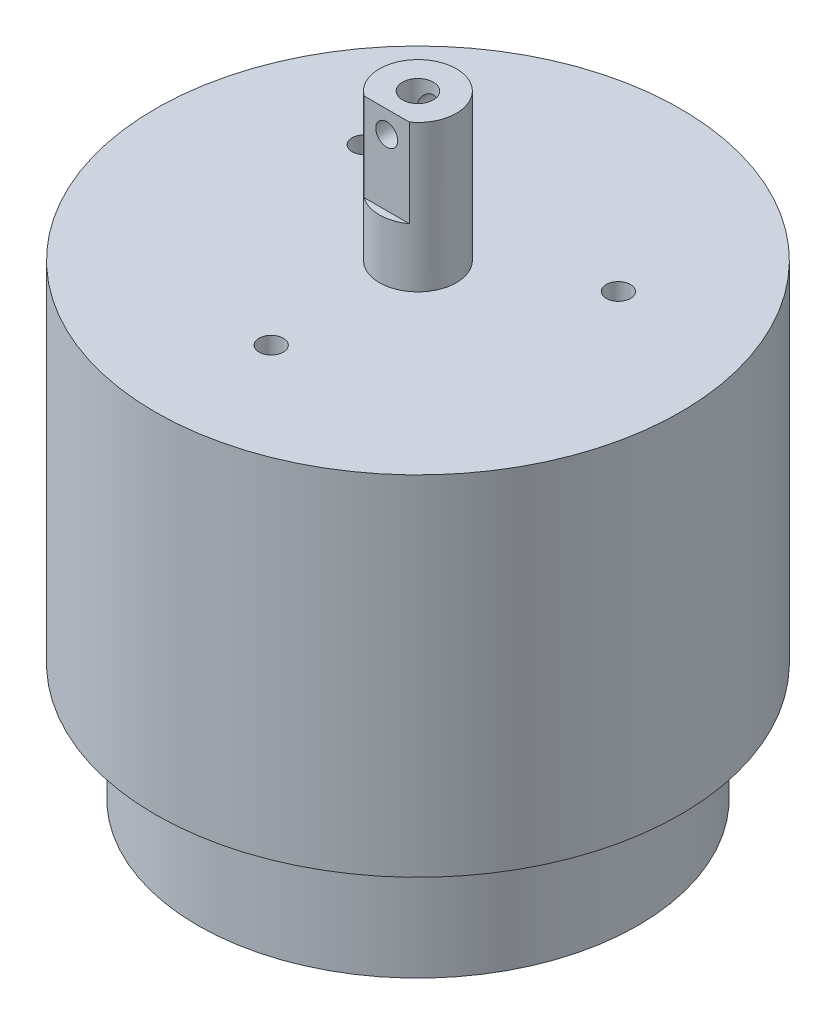
ISO-10303-21;
HEADER;
FILE_DESCRIPTION(('STEP AP214'),'2;1');
FILE_NAME('part.step','',(''),(''),'','','');
FILE_SCHEMA(('AUTOMOTIVE_DESIGN { 1 0 10303 214 1 1 1 1 }'));
ENDSEC;
DATA;
#1=APPLICATION_CONTEXT('core data for automotive mechanical design processes');
#2=APPLICATION_PROTOCOL_DEFINITION('international standard','automotive_design',2000,#1);
#3=PRODUCT_CONTEXT('',#1,'mechanical');
#4=PRODUCT('Part','Part','',(#3));
#5=PRODUCT_RELATED_PRODUCT_CATEGORY('part','',(#4));
#6=PRODUCT_DEFINITION_FORMATION('','',#4);
#7=PRODUCT_DEFINITION_CONTEXT('part definition',#1,'design');
#8=PRODUCT_DEFINITION('design','',#6,#7);
#9=PRODUCT_DEFINITION_SHAPE('','',#8);
#10=(LENGTH_UNIT() NAMED_UNIT(*) SI_UNIT(.MILLI.,.METRE.));
#11=(NAMED_UNIT(*) PLANE_ANGLE_UNIT() SI_UNIT($,.RADIAN.));
#12=(NAMED_UNIT(*) SI_UNIT($,.STERADIAN.) SOLID_ANGLE_UNIT());
#13=UNCERTAINTY_MEASURE_WITH_UNIT(LENGTH_MEASURE(1.E-05),#10,'distance_accuracy_value','');
#14=(GEOMETRIC_REPRESENTATION_CONTEXT(3) GLOBAL_UNCERTAINTY_ASSIGNED_CONTEXT((#13)) GLOBAL_UNIT_ASSIGNED_CONTEXT((#10,
#11,#12)) REPRESENTATION_CONTEXT('',''));
#15=CARTESIAN_POINT('',(0.,0.,0.));
#16=DIRECTION('',(0.,0.,1.));
#17=DIRECTION('',(1.,0.,0.));
#18=AXIS2_PLACEMENT_3D('',#15,#16,#17);
#19=CARTESIAN_POINT('',(0.,71.1000000000013,0.));
#20=DIRECTION('',(0.,1.,0.));
#21=DIRECTION('',(0.,0.,1.));
#22=AXIS2_PLACEMENT_3D('',#19,#20,#21);
#23=CONICAL_SURFACE('',#22,2.10000000004129,1.02974425868254);
#24=CARTESIAN_POINT('',(0.,69.8381927000469,-1.13686837721616E-10));
#25=VERTEX_POINT('',#24);
#26=VERTEX_LOOP('',#25);
#27=FACE_BOUND('',#26,.T.);
#28=CARTESIAN_POINT('',(0.,71.1,0.));
#29=DIRECTION('',(0.,1.,0.));
#30=DIRECTION('',(0.,0.,1.));
#31=AXIS2_PLACEMENT_3D('',#28,#29,#30);
#32=CIRCLE('',#31,2.09999999999999);
#33=CARTESIAN_POINT('',(0.,71.1,2.09999999999999));
#34=VERTEX_POINT('',#33);
#35=EDGE_CURVE('E74',#34,#34,#32,.T.);
#36=ORIENTED_EDGE('',*,*,#35,.T.);
#37=EDGE_LOOP('',(#36));
#38=FACE_BOUND('',#37,.T.);
#39=ADVANCED_FACE('F17',(#27,#38),#23,.F.);
#40=CARTESIAN_POINT('',(0.,80.5,-7.74999999999999));
#41=DIRECTION('',(0.,0.,1.));
#42=DIRECTION('',(1.,0.,0.));
#43=AXIS2_PLACEMENT_3D('',#40,#41,#42);
#44=CYLINDRICAL_SURFACE('',#43,1.5);
#45=CARTESIAN_POINT('',(0.,79.,2.09999999999999));
#46=CARTESIAN_POINT('',(-0.0740774746463869,79.0000092711209,2.09999136953813));
#47=CARTESIAN_POINT('',(-0.148275914544971,79.0055320042321,2.09603741324158));
#48=CARTESIAN_POINT('',(-0.294386719965176,79.0273060607499,2.08057005792307));
#49=CARTESIAN_POINT('',(-0.366292084814357,79.0435874519696,2.06903547339456));
#50=CARTESIAN_POINT('',(-0.505293802319431,79.0858136164265,2.03953340345317));
#51=CARTESIAN_POINT('',(-0.572415937857229,79.1117010260112,2.02160412899962));
#52=CARTESIAN_POINT('',(-0.700974026975551,79.1719635763802,1.98070495357211));
#53=CARTESIAN_POINT('',(-0.762412185862324,79.2063354061763,1.95773701928954));
#54=CARTESIAN_POINT('',(-0.884155194324282,79.2859055402968,1.90604971955428));
#55=CARTESIAN_POINT('',(-0.943861887546157,79.3317992474291,1.87699896374306));
#56=CARTESIAN_POINT('',(-1.0552663678185,79.4313533630777,1.81671004533098));
#57=CARTESIAN_POINT('',(-1.10695119102018,79.485026077808,1.78546845807938));
#58=CARTESIAN_POINT('',(-1.21059475402294,79.6099354740807,1.71725705316427));
#59=CARTESIAN_POINT('',(-1.26085931094469,79.6825873919012,1.68028933951373));
#60=CARTESIAN_POINT('',(-1.34854978273903,79.8372152400515,1.61075672459647));
#61=CARTESIAN_POINT('',(-1.38599317902657,79.9191782700082,1.57818586532633));
#62=CARTESIAN_POINT('',(-1.43670850335998,80.0643660131267,1.53188030804104));
#63=CARTESIAN_POINT('',(-1.45387910413773,80.1253615727881,1.51544400861268));
#64=CARTESIAN_POINT('',(-1.48044612666174,80.2503503107678,1.48950779871935));
#65=CARTESIAN_POINT('',(-1.48987090646917,80.3143316401089,1.47998260131529));
#66=CARTESIAN_POINT('',(-1.49673351046121,80.3990120677193,1.47302125518521));
#67=CARTESIAN_POINT('',(-1.49795633302597,80.4191650396952,1.47177743170133));
#68=CARTESIAN_POINT('',(-1.49959065508117,80.4595417021678,1.47011176825376));
#69=CARTESIAN_POINT('',(-1.50000194895198,80.4797654092868,1.46969013661178));
#70=CARTESIAN_POINT('',(-1.4999931285405,80.5713415066346,1.46970692277124));
#71=CARTESIAN_POINT('',(-1.49484935810922,80.6428183040006,1.47500728396916));
#72=CARTESIAN_POINT('',(-1.47476313583704,80.7830947385916,1.49507714126608));
#73=CARTESIAN_POINT('',(-1.45978557932529,80.8518838456713,1.5098805571593));
#74=CARTESIAN_POINT('',(-1.42136852119966,80.9841494360841,1.54608923119439));
#75=CARTESIAN_POINT('',(-1.39803450832146,81.0476805046318,1.56741172478962));
#76=CARTESIAN_POINT('',(-1.34384027495624,81.1697441012513,1.61411663009444));
#77=CARTESIAN_POINT('',(-1.3129813930372,81.2282775158377,1.63949831945434));
#78=CARTESIAN_POINT('',(-1.23801296193487,81.3505114615197,1.69704035137877));
#79=CARTESIAN_POINT('',(-1.19250935971336,81.4131750406712,1.72958770363064));
#80=CARTESIAN_POINT('',(-1.09234191504184,81.5309069171597,1.7945369660297));
#81=CARTESIAN_POINT('',(-1.03766655866761,81.5859655070153,1.82693864013381));
#82=CARTESIAN_POINT('',(-0.909132169654169,81.6966127542585,1.89463534069194));
#83=CARTESIAN_POINT('',(-0.833590466962458,81.7505817377756,1.92943254821958));
#84=CARTESIAN_POINT('',(-0.671513177823262,81.8445412210329,1.99162128421022));
#85=CARTESIAN_POINT('',(-0.584995553901268,81.8845541680033,2.01902468881818));
#86=CARTESIAN_POINT('',(-0.428710729768936,81.9391130711093,2.05688642313277));
#87=CARTESIAN_POINT('',(-0.360945723145463,81.9576436159245,2.06993610877063));
#88=CARTESIAN_POINT('',(-0.22267365533923,81.9850402981048,2.08931726746868));
#89=CARTESIAN_POINT('',(-0.152175731113056,81.9939361728556,2.09566941086043));
#90=CARTESIAN_POINT('',(-0.0542814395229907,81.9992662450265,2.09947640246212));
#91=CARTESIAN_POINT('',(-0.0271488435942426,82.0000033977969,2.10000316300008));
#92=CARTESIAN_POINT('',(0.074077474646386,81.9999907288791,2.09999136953813));
#93=CARTESIAN_POINT('',(0.148275914544971,81.9944679957679,2.09603741324158));
#94=CARTESIAN_POINT('',(0.294386719965175,81.97269393925,2.08057005792307));
#95=CARTESIAN_POINT('',(0.366292084814357,81.9564125480304,2.06903547339456));
#96=CARTESIAN_POINT('',(0.505293802319431,81.9141863835734,2.03953340345317));
#97=CARTESIAN_POINT('',(0.572415937857229,81.8882989739888,2.02160412899962));
#98=CARTESIAN_POINT('',(0.700974026975551,81.8280364236198,1.98070495357211));
#99=CARTESIAN_POINT('',(0.762412185862324,81.7936645938237,1.95773701928954));
#100=CARTESIAN_POINT('',(0.884155194324282,81.7140944597032,1.90604971955428));
#101=CARTESIAN_POINT('',(0.943861887546157,81.6682007525709,1.87699896374306));
#102=CARTESIAN_POINT('',(1.0552663678185,81.5686466369223,1.81671004533098));
#103=CARTESIAN_POINT('',(1.10695119102018,81.514973922192,1.78546845807938));
#104=CARTESIAN_POINT('',(1.21059475402294,81.3900645259193,1.71725705316427));
#105=CARTESIAN_POINT('',(1.26085931094469,81.3174126080988,1.68028933951373));
#106=CARTESIAN_POINT('',(1.34854978273903,81.1627847599485,1.61075672459647));
#107=CARTESIAN_POINT('',(1.38599317902657,81.0808217299917,1.57818586532633));
#108=CARTESIAN_POINT('',(1.43670850335998,80.9356339868733,1.53188030804104));
#109=CARTESIAN_POINT('',(1.45387910413773,80.8746384272119,1.51544400861268));
#110=CARTESIAN_POINT('',(1.48044612666174,80.7496496892322,1.48950779871935));
#111=CARTESIAN_POINT('',(1.48987090646917,80.6856683598911,1.47998260131529));
#112=CARTESIAN_POINT('',(1.49673351046121,80.6009879322807,1.47302125518521));
#113=CARTESIAN_POINT('',(1.49795633302597,80.5808349603047,1.47177743170133));
#114=CARTESIAN_POINT('',(1.49959065508117,80.5404582978322,1.47011176825376));
#115=CARTESIAN_POINT('',(1.50000194895198,80.5202345907132,1.46969013661178));
#116=CARTESIAN_POINT('',(1.4999931285405,80.4286584933654,1.46970692277124));
#117=CARTESIAN_POINT('',(1.49484935810922,80.3571816959994,1.47500728396916));
#118=CARTESIAN_POINT('',(1.47476313583704,80.2169052614084,1.49507714126608));
#119=CARTESIAN_POINT('',(1.45978557932529,80.1481161543287,1.50988055715929));
#120=CARTESIAN_POINT('',(1.42136852119966,80.0158505639159,1.54608923119439));
#121=CARTESIAN_POINT('',(1.39803450832146,79.9523194953682,1.56741172478962));
#122=CARTESIAN_POINT('',(1.34384027495623,79.8302558987487,1.61411663009444));
#123=CARTESIAN_POINT('',(1.3129813930372,79.7717224841623,1.63949831945434));
#124=CARTESIAN_POINT('',(1.23801296193488,79.6494885384803,1.69704035137876));
#125=CARTESIAN_POINT('',(1.19250935971337,79.5868249593288,1.72958770363063));
#126=CARTESIAN_POINT('',(1.09234191504186,79.4690930828403,1.79453696602969));
#127=CARTESIAN_POINT('',(1.03766655866762,79.4140344929847,1.8269386401338));
#128=CARTESIAN_POINT('',(0.909132169654184,79.3033872457415,1.89463534069193));
#129=CARTESIAN_POINT('',(0.833590466962475,79.2494182622243,1.92943254821957));
#130=CARTESIAN_POINT('',(0.671513177823281,79.155458778967,1.99162128421021));
#131=CARTESIAN_POINT('',(0.584995553901288,79.1154458319967,2.01902468881818));
#132=CARTESIAN_POINT('',(0.428710729768959,79.0608869288907,2.05688642313277));
#133=CARTESIAN_POINT('',(0.360945723145486,79.0423563840755,2.06993610877063));
#134=CARTESIAN_POINT('',(0.222673655339253,79.0149597018952,2.08931726746868));
#135=CARTESIAN_POINT('',(0.152175731113078,79.0060638271444,2.09566941086042));
#136=CARTESIAN_POINT('',(0.0542814395230046,79.0007337549735,2.09947640246212));
#137=CARTESIAN_POINT('',(0.027148843594249,78.9999966022031,2.10000316300008));
#138=CARTESIAN_POINT('',(0.,79.,2.09999999999999));
#139=B_SPLINE_CURVE_WITH_KNOTS('',3,(#45,#46,#47,#48,#49,#50,#51,#52,#53,#54,#55,#56,#57,#58,
#59,#60,#61,#62,#63,#64,#65,#66,#67,#68,#69,#70,#71,#72,#73,#74,#75,#76,#77,#78,#79,#80,#81,#82,
#83,#84,#85,#86,#87,#88,#89,#90,#91,#92,#93,#94,#95,#96,#97,#98,#99,#100,#101,#102,#103,#104,
#105,#106,#107,#108,#109,#110,#111,#112,#113,#114,#115,#116,#117,#118,#119,#120,#121,#122,#123,
#124,#125,#126,#127,#128,#129,#130,#131,#132,#133,#134,#135,#136,#137,#138),.UNSPECIFIED.,.T.,
.F.,(4,2,2,2,2,2,2,2,2,2,2,2,2,2,2,2,2,2,2,2,2,2,2,2,2,2,2,2,2,2,2,2,2,2,2,2,2,2,2,2,2,2,2,2,2,
2,4),(0.,0.222143821155451,0.444911120588835,0.66636899933538,0.887740591877598,
1.12900854696193,1.37066243514295,1.65671280801001,1.94237158877553,2.13805704411353,
2.33302284743167,2.39368196380894,2.45435644760814,2.66827770501668,2.88296680163653,
3.09503611376113,3.30706772923279,3.55819068379674,3.80963128214388,4.10542496197277,
4.40074066196913,4.614219352564,4.82703724726918,4.90845130579056,5.13059512694601,
5.35336242637939,5.57482030512594,5.79619189766816,6.03745985275248,6.27911374093351,
6.56516411380057,6.85082289456608,7.04650834990409,7.24147415322222,7.3021332695995,
7.36280775339868,7.57672901080723,7.79141810742707,8.00348741955171,8.21551903502333,
8.46664198958727,8.71808258793441,9.01387626776332,9.30919196775966,9.52267065835454,
9.73548855305972,9.81690261158112),.UNSPECIFIED.);
#140=CARTESIAN_POINT('',(0.,79.,2.09999999999999));
#141=VERTEX_POINT('',#140);
#142=EDGE_CURVE('E20',#141,#141,#139,.T.);
#143=ORIENTED_EDGE('',*,*,#142,.T.);
#144=EDGE_LOOP('',(#143));
#145=FACE_BOUND('',#144,.T.);
#146=CARTESIAN_POINT('',(0.,80.5,4.25));
#147=DIRECTION('',(0.,0.,1.));
#148=DIRECTION('',(1.,0.,0.));
#149=AXIS2_PLACEMENT_3D('',#146,#147,#148);
#150=CIRCLE('',#149,1.5);
#151=CARTESIAN_POINT('',(1.5,80.5,4.25));
#152=VERTEX_POINT('',#151);
#153=EDGE_CURVE('E77',#152,#152,#150,.T.);
#154=ORIENTED_EDGE('',*,*,#153,.T.);
#155=EDGE_LOOP('',(#154));
#156=FACE_BOUND('',#155,.T.);
#157=ADVANCED_FACE('F71',(#145,#156),#44,.F.);
#158=CARTESIAN_POINT('',(0.,83.5,0.));
#159=DIRECTION('',(0.,1.,0.));
#160=DIRECTION('',(0.,0.,1.));
#161=AXIS2_PLACEMENT_3D('',#158,#159,#160);
#162=CYLINDRICAL_SURFACE('',#161,2.09999999999999);
#163=ORIENTED_EDGE('',*,*,#142,.F.);
#164=EDGE_LOOP('',(#163));
#165=FACE_BOUND('',#164,.T.);
#166=CARTESIAN_POINT('',(0.,83.5,0.));
#167=DIRECTION('',(0.,1.,0.));
#168=DIRECTION('',(0.,0.,1.));
#169=AXIS2_PLACEMENT_3D('',#166,#167,#168);
#170=CIRCLE('',#169,2.09999999999999);
#171=CARTESIAN_POINT('',(0.,83.5,2.09999999999999));
#172=VERTEX_POINT('',#171);
#173=EDGE_CURVE('E329',#172,#172,#170,.T.);
#174=ORIENTED_EDGE('',*,*,#173,.T.);
#175=EDGE_LOOP('',(#174));
#176=FACE_BOUND('',#175,.T.);
#177=CARTESIAN_POINT('',(1.5,80.5,-1.46969384566989));
#178=CARTESIAN_POINT('',(1.4999931285405,80.4286584933654,-1.46970692277124));
#179=CARTESIAN_POINT('',(1.49484935810922,80.3571816959994,-1.47500728396916));
#180=CARTESIAN_POINT('',(1.47476313583704,80.2169052614084,-1.49507714126608));
#181=CARTESIAN_POINT('',(1.45978557932529,80.1481161543287,-1.50988055715929));
#182=CARTESIAN_POINT('',(1.42136852119966,80.0158505639159,-1.54608923119439));
#183=CARTESIAN_POINT('',(1.39803450832146,79.9523194953682,-1.56741172478962));
#184=CARTESIAN_POINT('',(1.34384027495624,79.8302558987487,-1.61411663009444));
#185=CARTESIAN_POINT('',(1.3129813930372,79.7717224841623,-1.63949831945433));
#186=CARTESIAN_POINT('',(1.23801296193488,79.6494885384803,-1.69704035137876));
#187=CARTESIAN_POINT('',(1.19250935971337,79.5868249593288,-1.72958770363063));
#188=CARTESIAN_POINT('',(1.09234191504186,79.4690930828403,-1.79453696602969));
#189=CARTESIAN_POINT('',(1.03766655866762,79.4140344929847,-1.8269386401338));
#190=CARTESIAN_POINT('',(0.909132169654182,79.3033872457415,-1.89463534069193));
#191=CARTESIAN_POINT('',(0.833590466962471,79.2494182622243,-1.92943254821957));
#192=CARTESIAN_POINT('',(0.671513177823277,79.155458778967,-1.99162128421021));
#193=CARTESIAN_POINT('',(0.584995553901286,79.1154458319967,-2.01902468881818));
#194=CARTESIAN_POINT('',(0.428710729768957,79.0608869288907,-2.05688642313277));
#195=CARTESIAN_POINT('',(0.360945723145483,79.0423563840755,-2.06993610877063));
#196=CARTESIAN_POINT('',(0.222673655339249,79.0149597018952,-2.08931726746868));
#197=CARTESIAN_POINT('',(0.152175731113077,79.0060638271444,-2.09566941086042));
#198=CARTESIAN_POINT('',(0.0542814395230067,79.0007337549735,-2.09947640246212));
#199=CARTESIAN_POINT('',(0.0271488435942527,78.9999966022031,-2.10000316300008));
#200=CARTESIAN_POINT('',(-0.0740774746463809,79.0000092711209,-2.09999136953813));
#201=CARTESIAN_POINT('',(-0.148275914544964,79.0055320042321,-2.09603741324158));
#202=CARTESIAN_POINT('',(-0.294386719965169,79.0273060607499,-2.08057005792307));
#203=CARTESIAN_POINT('',(-0.366292084814351,79.0435874519696,-2.06903547339456));
#204=CARTESIAN_POINT('',(-0.505293802319426,79.0858136164265,-2.03953340345317));
#205=CARTESIAN_POINT('',(-0.572415937857225,79.1117010260112,-2.02160412899962));
#206=CARTESIAN_POINT('',(-0.700974026975547,79.1719635763802,-1.98070495357211));
#207=CARTESIAN_POINT('',(-0.762412185862321,79.2063354061763,-1.95773701928954));
#208=CARTESIAN_POINT('',(-0.884155194324279,79.2859055402968,-1.90604971955429));
#209=CARTESIAN_POINT('',(-0.943861887546154,79.3317992474291,-1.87699896374306));
#210=CARTESIAN_POINT('',(-1.0552663678185,79.4313533630777,-1.81671004533098));
#211=CARTESIAN_POINT('',(-1.10695119102018,79.485026077808,-1.78546845807938));
#212=CARTESIAN_POINT('',(-1.21059475402293,79.6099354740807,-1.71725705316427));
#213=CARTESIAN_POINT('',(-1.26085931094469,79.6825873919012,-1.68028933951373));
#214=CARTESIAN_POINT('',(-1.34854978273903,79.8372152400515,-1.61075672459647));
#215=CARTESIAN_POINT('',(-1.38599317902657,79.9191782700082,-1.57818586532634));
#216=CARTESIAN_POINT('',(-1.43670850335998,80.0643660131267,-1.53188030804104));
#217=CARTESIAN_POINT('',(-1.45387910413773,80.1253615727881,-1.51544400861268));
#218=CARTESIAN_POINT('',(-1.48044612666174,80.2503503107678,-1.48950779871935));
#219=CARTESIAN_POINT('',(-1.48987090646917,80.3143316401089,-1.47998260131529));
#220=CARTESIAN_POINT('',(-1.49673351046121,80.3990120677193,-1.47302125518521));
#221=CARTESIAN_POINT('',(-1.49795633302597,80.4191650396952,-1.47177743170133));
#222=CARTESIAN_POINT('',(-1.49959065508117,80.4595417021678,-1.47011176825376));
#223=CARTESIAN_POINT('',(-1.50000194895198,80.4797654092868,-1.46969013661178));
#224=CARTESIAN_POINT('',(-1.4999931285405,80.5713415066346,-1.46970692277124));
#225=CARTESIAN_POINT('',(-1.49484935810922,80.6428183040006,-1.47500728396916));
#226=CARTESIAN_POINT('',(-1.47476313583704,80.7830947385916,-1.49507714126608));
#227=CARTESIAN_POINT('',(-1.45978557932529,80.8518838456712,-1.50988055715929));
#228=CARTESIAN_POINT('',(-1.42136852119966,80.9841494360841,-1.54608923119439));
#229=CARTESIAN_POINT('',(-1.39803450832146,81.0476805046318,-1.56741172478962));
#230=CARTESIAN_POINT('',(-1.34384027495624,81.1697441012513,-1.61411663009444));
#231=CARTESIAN_POINT('',(-1.3129813930372,81.2282775158377,-1.63949831945433));
#232=CARTESIAN_POINT('',(-1.23801296193488,81.3505114615196,-1.69704035137876));
#233=CARTESIAN_POINT('',(-1.19250935971337,81.4131750406712,-1.72958770363063));
#234=CARTESIAN_POINT('',(-1.09234191504186,81.5309069171597,-1.79453696602969));
#235=CARTESIAN_POINT('',(-1.03766655866762,81.5859655070153,-1.8269386401338));
#236=CARTESIAN_POINT('',(-0.909132169654184,81.6966127542585,-1.89463534069193));
#237=CARTESIAN_POINT('',(-0.833590466962475,81.7505817377756,-1.92943254821957));
#238=CARTESIAN_POINT('',(-0.671513177823281,81.8445412210329,-1.99162128421021));
#239=CARTESIAN_POINT('',(-0.584995553901288,81.8845541680033,-2.01902468881818));
#240=CARTESIAN_POINT('',(-0.428710729768959,81.9391130711093,-2.05688642313277));
#241=CARTESIAN_POINT('',(-0.360945723145487,81.9576436159245,-2.06993610877063));
#242=CARTESIAN_POINT('',(-0.222673655339254,81.9850402981048,-2.08931726746868));
#243=CARTESIAN_POINT('',(-0.15217573111308,81.9939361728556,-2.09566941086042));
#244=CARTESIAN_POINT('',(-0.0542814395229998,81.9992662450265,-2.09947640246212));
#245=CARTESIAN_POINT('',(-0.0271488435942369,82.0000033977969,-2.10000316300008));
#246=CARTESIAN_POINT('',(0.0740774746464066,81.9999907288791,-2.09999136953813));
#247=CARTESIAN_POINT('',(0.148275914544992,81.9944679957679,-2.09603741324157));
#248=CARTESIAN_POINT('',(0.294386719965196,81.97269393925,-2.08057005792307));
#249=CARTESIAN_POINT('',(0.366292084814375,81.9564125480304,-2.06903547339456));
#250=CARTESIAN_POINT('',(0.505293802319449,81.9141863835734,-2.03953340345316));
#251=CARTESIAN_POINT('',(0.572415937857248,81.8882989739888,-2.02160412899962));
#252=CARTESIAN_POINT('',(0.700974026975571,81.8280364236198,-1.98070495357211));
#253=CARTESIAN_POINT('',(0.762412185862343,81.7936645938237,-1.95773701928953));
#254=CARTESIAN_POINT('',(0.884155194324299,81.7140944597031,-1.90604971955428));
#255=CARTESIAN_POINT('',(0.943861887546174,81.6682007525709,-1.87699896374305));
#256=CARTESIAN_POINT('',(1.05526636781852,81.5686466369223,-1.81671004533097));
#257=CARTESIAN_POINT('',(1.1069511910202,81.514973922192,-1.78546845807937));
#258=CARTESIAN_POINT('',(1.21059475402295,81.3900645259193,-1.71725705316426));
#259=CARTESIAN_POINT('',(1.2608593109447,81.3174126080988,-1.68028933951371));
#260=CARTESIAN_POINT('',(1.34854978273904,81.1627847599485,-1.61075672459645));
#261=CARTESIAN_POINT('',(1.38599317902658,81.0808217299917,-1.57818586532632));
#262=CARTESIAN_POINT('',(1.43670850335999,80.9356339868733,-1.53188030804104));
#263=CARTESIAN_POINT('',(1.45387910413774,80.8746384272119,-1.51544400861267));
#264=CARTESIAN_POINT('',(1.48044612666175,80.7496496892321,-1.48950779871935));
#265=CARTESIAN_POINT('',(1.48987090646918,80.6856683598911,-1.47998260131528));
#266=CARTESIAN_POINT('',(1.49673351046121,80.6009879322807,-1.47302125518521));
#267=CARTESIAN_POINT('',(1.49795633302597,80.5808349603047,-1.47177743170133));
#268=CARTESIAN_POINT('',(1.49959065508117,80.5404582978322,-1.47011176825376));
#269=CARTESIAN_POINT('',(1.50000194895198,80.5202345907132,-1.46969013661178));
#270=CARTESIAN_POINT('',(1.5,80.5,-1.46969384566989));
#271=B_SPLINE_CURVE_WITH_KNOTS('',3,(#177,#178,#179,#180,#181,#182,#183,#184,#185,#186,#187,
#188,#189,#190,#191,#192,#193,#194,#195,#196,#197,#198,#199,#200,#201,#202,#203,#204,#205,#206,
#207,#208,#209,#210,#211,#212,#213,#214,#215,#216,#217,#218,#219,#220,#221,#222,#223,#224,#225,
#226,#227,#228,#229,#230,#231,#232,#233,#234,#235,#236,#237,#238,#239,#240,#241,#242,#243,#244,
#245,#246,#247,#248,#249,#250,#251,#252,#253,#254,#255,#256,#257,#258,#259,#260,#261,#262,#263,
#264,#265,#266,#267,#268,#269,#270),.UNSPECIFIED.,.T.,.F.,(4,2,2,2,2,2,2,2,2,2,2,2,2,2,2,2,2,2,
2,2,2,2,2,2,2,2,2,2,2,2,2,2,2,2,2,2,2,2,2,2,2,2,2,2,2,2,4),(0.,0.21392125740855,
0.428610354028387,0.640679666152999,0.852711281624643,1.10383423618859,1.35527483453573,
1.65106851436464,1.94638421436098,2.15986290495585,2.37268079966103,2.45409485818242,
2.67623867933787,2.89900597877126,3.1204638575178,3.34183545006002,3.58310340514435,
3.82475729332537,4.11080766619244,4.39646644695795,4.59215190229596,4.78711770561409,
4.84777682199137,4.90845130579055,5.1223725631991,5.33706165981894,5.54913097194355,
5.7611625874152,6.01228554197914,6.26372614032628,6.55951982015518,6.85483552015153,
7.0683142107464,7.28113210545158,7.362546163973,7.58468998512845,7.80745728456184,
8.02891516330838,8.25028675585061,8.49155471093493,8.73320859911596,9.01925897198303,
9.30491775274854,9.50060320808654,9.69556901140468,9.75622812778192,9.81690261158111),.UNSPECIFIED.);
#272=CARTESIAN_POINT('',(1.5,80.5,-1.46969384566989));
#273=VERTEX_POINT('',#272);
#274=EDGE_CURVE('E321',#273,#273,#271,.T.);
#275=ORIENTED_EDGE('',*,*,#274,.T.);
#276=EDGE_LOOP('',(#275));
#277=FACE_BOUND('',#276,.T.);
#278=ORIENTED_EDGE('',*,*,#35,.F.);
#279=EDGE_LOOP('',(#278));
#280=FACE_BOUND('',#279,.T.);
#281=ADVANCED_FACE('F278',(#165,#176,#277,#280),#162,.F.);
#282=CARTESIAN_POINT('',(0.,0.,0.));
#283=DIRECTION('',(0.,1.,0.));
#284=DIRECTION('',(0.,0.,1.));
#285=AXIS2_PLACEMENT_3D('',#282,#283,#284);
#286=PLANE('',#285);
#287=CARTESIAN_POINT('',(0.,0.,0.));
#288=DIRECTION('',(0.,1.,0.));
#289=DIRECTION('',(0.,0.,1.));
#290=AXIS2_PLACEMENT_3D('',#287,#288,#289);
#291=CIRCLE('',#290,30.);
#292=CARTESIAN_POINT('',(0.,0.,30.));
#293=VERTEX_POINT('',#292);
#294=EDGE_CURVE('E328',#293,#293,#291,.T.);
#295=ORIENTED_EDGE('',*,*,#294,.F.);
#296=EDGE_LOOP('',(#295));
#297=FACE_BOUND('',#296,.T.);
#298=ADVANCED_FACE('F270',(#297),#286,.F.);
#299=CARTESIAN_POINT('',(17.3205080756889,57.399999999916,-9.99999999999984));
#300=DIRECTION('',(0.,1.,0.));
#301=DIRECTION('',(0.,0.,1.));
#302=AXIS2_PLACEMENT_3D('',#299,#300,#301);
#303=CONICAL_SURFACE('',#302,1.64999999987897,1.02974425868107);
#304=CARTESIAN_POINT('',(17.3205080756889,56.4085799786085,-9.99999999999984));
#305=VERTEX_POINT('',#304);
#306=VERTEX_LOOP('',#305);
#307=FACE_BOUND('',#306,.T.);
#308=CARTESIAN_POINT('',(17.3205080756889,57.4,-9.99999999999984));
#309=DIRECTION('',(0.,1.,0.));
#310=DIRECTION('',(0.,0.,1.));
#311=AXIS2_PLACEMENT_3D('',#308,#309,#310);
#312=CIRCLE('',#311,1.65);
#313=CARTESIAN_POINT('',(17.3205080756889,57.4,-8.34999999999984));
#314=VERTEX_POINT('',#313);
#315=EDGE_CURVE('E86',#314,#314,#312,.T.);
#316=ORIENTED_EDGE('',*,*,#315,.T.);
#317=EDGE_LOOP('',(#316));
#318=FACE_BOUND('',#317,.T.);
#319=ADVANCED_FACE('F261',(#307,#318),#303,.F.);
#320=CARTESIAN_POINT('',(0.,57.399999999916,20.));
#321=DIRECTION('',(0.,1.,0.));
#322=DIRECTION('',(0.,0.,1.));
#323=AXIS2_PLACEMENT_3D('',#320,#321,#322);
#324=CONICAL_SURFACE('',#323,1.64999999990869,1.02974425868654);
#325=CARTESIAN_POINT('',(0.,56.4085799786085,20.));
#326=VERTEX_POINT('',#325);
#327=VERTEX_LOOP('',#326);
#328=FACE_BOUND('',#327,.T.);
#329=CARTESIAN_POINT('',(0.,57.4,20.));
#330=DIRECTION('',(0.,1.,0.));
#331=DIRECTION('',(0.,0.,1.));
#332=AXIS2_PLACEMENT_3D('',#329,#330,#331);
#333=CIRCLE('',#332,1.65);
#334=CARTESIAN_POINT('',(0.,57.4,21.65));
#335=VERTEX_POINT('',#334);
#336=EDGE_CURVE('E347',#335,#335,#333,.T.);
#337=ORIENTED_EDGE('',*,*,#336,.T.);
#338=EDGE_LOOP('',(#337));
#339=FACE_BOUND('',#338,.T.);
#340=ADVANCED_FACE('F253',(#328,#339),#324,.F.);
#341=CARTESIAN_POINT('',(-17.3205080756887,57.399999999916,-10.0000000000001));
#342=DIRECTION('',(0.,1.,0.));
#343=DIRECTION('',(0.,0.,1.));
#344=AXIS2_PLACEMENT_3D('',#341,#342,#343);
#345=CONICAL_SURFACE('',#344,1.64999999987921,1.02974425868107);
#346=CARTESIAN_POINT('',(-17.3205080756887,56.4085799786085,-10.0000000000001));
#347=VERTEX_POINT('',#346);
#348=VERTEX_LOOP('',#347);
#349=FACE_BOUND('',#348,.T.);
#350=CARTESIAN_POINT('',(-17.3205080756887,57.4,-10.0000000000001));
#351=DIRECTION('',(0.,1.,0.));
#352=DIRECTION('',(0.,0.,1.));
#353=AXIS2_PLACEMENT_3D('',#350,#351,#352);
#354=CIRCLE('',#353,1.65);
#355=CARTESIAN_POINT('',(-17.3205080756887,57.4,-8.35000000000008));
#356=VERTEX_POINT('',#355);
#357=EDGE_CURVE('E344',#356,#356,#354,.T.);
#358=ORIENTED_EDGE('',*,*,#357,.T.);
#359=EDGE_LOOP('',(#358));
#360=FACE_BOUND('',#359,.T.);
#361=ADVANCED_FACE('F245',(#349,#360),#345,.F.);
#362=CARTESIAN_POINT('',(0.,71.5,0.));
#363=DIRECTION('',(0.,-1.,0.));
#364=DIRECTION('',(0.,0.,-1.));
#365=AXIS2_PLACEMENT_3D('',#362,#363,#364);
#366=PLANE('',#365);
#367=CARTESIAN_POINT('',(0.,71.5,0.));
#368=DIRECTION('',(0.,1.,0.));
#369=DIRECTION('',(0.,0.,1.));
#370=AXIS2_PLACEMENT_3D('',#367,#368,#369);
#371=CIRCLE('',#370,5.25);
#372=CARTESIAN_POINT('',(3.08220700148449,71.5,4.25));
#373=VERTEX_POINT('',#372);
#374=CARTESIAN_POINT('',(-3.08220700148449,71.5,4.25));
#375=VERTEX_POINT('',#374);
#376=EDGE_CURVE('E50',#373,#375,#371,.F.);
#377=ORIENTED_EDGE('',*,*,#376,.F.);
#378=DIRECTION('',(-1.,0.,0.));
#379=VECTOR('',#378,1.);
#380=CARTESIAN_POINT('',(-9.30683298298973,71.5,4.25));
#381=LINE('',#380,#379);
#382=EDGE_CURVE('E83',#373,#375,#381,.T.);
#383=ORIENTED_EDGE('',*,*,#382,.T.);
#384=EDGE_LOOP('',(#377,#383));
#385=FACE_BOUND('',#384,.T.);
#386=ADVANCED_FACE('F237',(#385),#366,.F.);
#387=CARTESIAN_POINT('',(-9.30683298298973,71.5,4.25));
#388=DIRECTION('',(0.,0.,-1.));
#389=DIRECTION('',(-1.,0.,0.));
#390=AXIS2_PLACEMENT_3D('',#387,#388,#389);
#391=PLANE('',#390);
#392=DIRECTION('',(0.,1.,0.));
#393=VECTOR('',#392,1.);
#394=CARTESIAN_POINT('',(3.08220700148449,83.5,4.25));
#395=LINE('',#394,#393);
#396=CARTESIAN_POINT('',(3.08220700148449,83.5,4.25));
#397=VERTEX_POINT('',#396);
#398=EDGE_CURVE('E341',#397,#373,#395,.F.);
#399=ORIENTED_EDGE('',*,*,#398,.F.);
#400=DIRECTION('',(1.,0.,0.));
#401=VECTOR('',#400,1.);
#402=CARTESIAN_POINT('',(5.25,83.5,4.25));
#403=LINE('',#402,#401);
#404=CARTESIAN_POINT('',(-3.08220700148449,83.5,4.25));
#405=VERTEX_POINT('',#404);
#406=EDGE_CURVE('E39',#397,#405,#403,.F.);
#407=ORIENTED_EDGE('',*,*,#406,.T.);
#408=DIRECTION('',(0.,1.,0.));
#409=VECTOR('',#408,1.);
#410=CARTESIAN_POINT('',(-3.08220700148449,83.5,4.25));
#411=LINE('',#410,#409);
#412=EDGE_CURVE('E340',#375,#405,#411,.T.);
#413=ORIENTED_EDGE('',*,*,#412,.F.);
#414=ORIENTED_EDGE('',*,*,#382,.F.);
#415=EDGE_LOOP('',(#399,#407,#413,#414));
#416=FACE_BOUND('',#415,.T.);
#417=ORIENTED_EDGE('',*,*,#153,.F.);
#418=EDGE_LOOP('',(#417));
#419=FACE_BOUND('',#418,.T.);
#420=ADVANCED_FACE('F229',(#416,#419),#391,.F.);
#421=CARTESIAN_POINT('',(5.25,83.5,0.));
#422=DIRECTION('',(0.,-1.,0.));
#423=DIRECTION('',(0.,0.,-1.));
#424=AXIS2_PLACEMENT_3D('',#421,#422,#423);
#425=PLANE('',#424);
#426=CARTESIAN_POINT('',(0.,83.5,0.));
#427=DIRECTION('',(0.,1.,0.));
#428=DIRECTION('',(0.,0.,1.));
#429=AXIS2_PLACEMENT_3D('',#426,#427,#428);
#430=CIRCLE('',#429,5.25);
#431=EDGE_CURVE('E57',#405,#397,#430,.F.);
#432=ORIENTED_EDGE('',*,*,#431,.F.);
#433=ORIENTED_EDGE('',*,*,#406,.F.);
#434=EDGE_LOOP('',(#432,#433));
#435=FACE_BOUND('',#434,.T.);
#436=ORIENTED_EDGE('',*,*,#173,.F.);
#437=EDGE_LOOP('',(#436));
#438=FACE_BOUND('',#437,.T.);
#439=ADVANCED_FACE('F151',(#435,#438),#425,.F.);
#440=CARTESIAN_POINT('',(0.,80.5,-7.74999999999999));
#441=DIRECTION('',(0.,0.,1.));
#442=DIRECTION('',(1.,0.,0.));
#443=AXIS2_PLACEMENT_3D('',#440,#441,#442);
#444=CYLINDRICAL_SURFACE('',#443,1.5);
#445=ORIENTED_EDGE('',*,*,#274,.F.);
#446=EDGE_LOOP('',(#445));
#447=FACE_BOUND('',#446,.T.);
#448=CARTESIAN_POINT('',(1.5,80.5,-5.03115294937453));
#449=CARTESIAN_POINT('',(1.49999639046667,80.5823487459319,-5.03115566326588));
#450=CARTESIAN_POINT('',(1.49319219728931,80.6647424475361,-5.03319812340327));
#451=CARTESIAN_POINT('',(1.46620434633812,80.8271641682389,-5.04112428960181));
#452=CARTESIAN_POINT('',(1.44600793041343,80.9071898554254,-5.04701165844864));
#453=CARTESIAN_POINT('',(1.39296814895042,81.0624569065585,-5.06190593160319));
#454=CARTESIAN_POINT('',(1.36014698558027,81.1377064008802,-5.07090735668027));
#455=CARTESIAN_POINT('',(1.28285675576292,81.2816354265711,-5.09100836939558));
#456=CARTESIAN_POINT('',(1.23838786706739,81.3503150581788,-5.10210792501429));
#457=CARTESIAN_POINT('',(1.13769890085941,81.4811368570851,-5.12551218421236));
#458=CARTESIAN_POINT('',(1.08120391069349,81.5430632193206,-5.13784068123399));
#459=CARTESIAN_POINT('',(0.958641278226138,81.6567166800664,-5.16211230899859));
#460=CARTESIAN_POINT('',(0.892570587171516,81.7084405178228,-5.1740553155211));
#461=CARTESIAN_POINT('',(0.751201723687883,81.8011441347853,-5.19648055442425));
#462=CARTESIAN_POINT('',(0.675752150469651,81.8419012367011,-5.20693074057454));
#463=CARTESIAN_POINT('',(0.518768280033843,81.9100291720923,-5.22490136155437));
#464=CARTESIAN_POINT('',(0.437241216179759,81.9374156349598,-5.23242521497009));
#465=CARTESIAN_POINT('',(0.296103503685323,81.9716889228979,-5.24196480728705));
#466=CARTESIAN_POINT('',(0.237433365488704,81.9822860160821,-5.24496194541003));
#467=CARTESIAN_POINT('',(0.119183264005413,81.9964426690477,-5.24898033476899));
#468=CARTESIAN_POINT('',(0.0596033443081157,82.0000025649351,-5.25000168037145));
#469=CARTESIAN_POINT('',(-0.0824260618652026,81.9999964529255,-5.2499976761975));
#470=CARTESIAN_POINT('',(-0.164896921896214,81.9931799128696,-5.24803887648494));
#471=CARTESIAN_POINT('',(-0.327479187071086,81.9661385538102,-5.24041028439693));
#472=CARTESIAN_POINT('',(-0.407588322335572,81.9459012483093,-5.23473703621183));
#473=CARTESIAN_POINT('',(-0.563032300588358,81.8927420237124,-5.22030459996062));
#474=CARTESIAN_POINT('',(-0.638374574677611,81.8598404442223,-5.21155036207553));
#475=CARTESIAN_POINT('',(-0.782461250020589,81.7823604487981,-5.1918733800869));
#476=CARTESIAN_POINT('',(-0.851205854879881,81.7377823933609,-5.18095070293385));
#477=CARTESIAN_POINT('',(-0.981964018141065,81.6369790530392,-5.15778668802936));
#478=CARTESIAN_POINT('',(-1.04378016089262,81.5805034587833,-5.14552029125877));
#479=CARTESIAN_POINT('',(-1.15721811501969,81.4580270389774,-5.12120297351573));
#480=CARTESIAN_POINT('',(-1.20883632799568,81.3920228653797,-5.10915212996174));
#481=CARTESIAN_POINT('',(-1.30142122933163,81.2507217738361,-5.08636689476197));
#482=CARTESIAN_POINT('',(-1.34214794130839,81.1752621302502,-5.07566454447722));
#483=CARTESIAN_POINT('',(-1.41021679667942,81.0182571968946,-5.05717752071929));
#484=CARTESIAN_POINT('',(-1.4375749353256,80.9367193149851,-5.04938936309602));
#485=CARTESIAN_POINT('',(-1.47177510177931,80.7956548688717,-5.03950213691368));
#486=CARTESIAN_POINT('',(-1.48233966343863,80.7370751849101,-5.03638991880471));
#487=CARTESIAN_POINT('',(-1.49645322110759,80.6190047935087,-5.03221440153175));
#488=CARTESIAN_POINT('',(-1.50000260864035,80.5595141370979,-5.03115098802223));
#489=CARTESIAN_POINT('',(-1.49999639046667,80.4176512540681,-5.03115566326589));
#490=CARTESIAN_POINT('',(-1.49319219728931,80.3352575524638,-5.03319812340327));
#491=CARTESIAN_POINT('',(-1.46620434633812,80.1728358317611,-5.04112428960181));
#492=CARTESIAN_POINT('',(-1.44600793041343,80.0928101445745,-5.04701165844864));
#493=CARTESIAN_POINT('',(-1.39296814895042,79.9375430934415,-5.06190593160319));
#494=CARTESIAN_POINT('',(-1.36014698558027,79.8622935991198,-5.07090735668027));
#495=CARTESIAN_POINT('',(-1.28285675576292,79.7183645734289,-5.09100836939558));
#496=CARTESIAN_POINT('',(-1.23838786706739,79.6496849418212,-5.10210792501429));
#497=CARTESIAN_POINT('',(-1.13769890085941,79.5188631429149,-5.12551218421236));
#498=CARTESIAN_POINT('',(-1.08120391069349,79.4569367806793,-5.13784068123399));
#499=CARTESIAN_POINT('',(-0.958641278226138,79.3432833199336,-5.16211230899859));
#500=CARTESIAN_POINT('',(-0.892570587171516,79.2915594821772,-5.1740553155211));
#501=CARTESIAN_POINT('',(-0.751201723687883,79.1988558652147,-5.19648055442425));
#502=CARTESIAN_POINT('',(-0.675752150469651,79.1580987632988,-5.20693074057454));
#503=CARTESIAN_POINT('',(-0.518768280033843,79.0899708279077,-5.22490136155437));
#504=CARTESIAN_POINT('',(-0.437241216179759,79.0625843650402,-5.23242521497009));
#505=CARTESIAN_POINT('',(-0.2961035036854,79.0283110771021,-5.24196480728704));
#506=CARTESIAN_POINT('',(-0.237433365488858,79.0177139839179,-5.24496194541002));
#507=CARTESIAN_POINT('',(-0.119183264005726,79.0035573309523,-5.24898033476898));
#508=CARTESIAN_POINT('',(-0.0596033443085079,78.9999974350649,-5.25000168037144));
#509=CARTESIAN_POINT('',(0.08242606186473,79.0000035470745,-5.24999767619751));
#510=CARTESIAN_POINT('',(0.164896921895741,79.0068200871303,-5.24803887648495));
#511=CARTESIAN_POINT('',(0.32747918707062,79.0338614461896,-5.24041028439696));
#512=CARTESIAN_POINT('',(0.407588322335112,79.0540987516906,-5.23473703621186));
#513=CARTESIAN_POINT('',(0.563032300587908,79.1072579762874,-5.22030459996067));
#514=CARTESIAN_POINT('',(0.638374574677166,79.1401595557774,-5.21155036207558));
#515=CARTESIAN_POINT('',(0.782461250020167,79.2176395512016,-5.19187338008697));
#516=CARTESIAN_POINT('',(0.851205854879475,79.2622176066388,-5.18095070293391));
#517=CARTESIAN_POINT('',(0.981964018140687,79.3630209469604,-5.15778668802943));
#518=CARTESIAN_POINT('',(1.04378016089225,79.4194965412163,-5.14552029125884));
#519=CARTESIAN_POINT('',(1.15721811501936,79.5419729610221,-5.1212029735158));
#520=CARTESIAN_POINT('',(1.20883632799539,79.6079771346199,-5.10915212996181));
#521=CARTESIAN_POINT('',(1.30142122933138,79.7492782261635,-5.08636689476203));
#522=CARTESIAN_POINT('',(1.34214794130817,79.8247378697493,-5.07566454447728));
#523=CARTESIAN_POINT('',(1.41021679667925,79.9817428031049,-5.05717752071934));
#524=CARTESIAN_POINT('',(1.43757493532545,80.0632806850144,-5.04938936309606));
#525=CARTESIAN_POINT('',(1.47177510177923,80.2043451311279,-5.0395021369137));
#526=CARTESIAN_POINT('',(1.48233966343858,80.2629248150896,-5.03638991880472));
#527=CARTESIAN_POINT('',(1.49645322110758,80.3809952064911,-5.03221440153175));
#528=CARTESIAN_POINT('',(1.50000260864035,80.440485862902,-5.03115098802223));
#529=CARTESIAN_POINT('',(1.5,80.5,-5.03115294937453));
#530=B_SPLINE_CURVE_WITH_KNOTS('',3,(#448,#449,#450,#451,#452,#453,#454,#455,#456,#457,#458,
#459,#460,#461,#462,#463,#464,#465,#466,#467,#468,#469,#470,#471,#472,#473,#474,#475,#476,#477,
#478,#479,#480,#481,#482,#483,#484,#485,#486,#487,#488,#489,#490,#491,#492,#493,#494,#495,#496,
#497,#498,#499,#500,#501,#502,#503,#504,#505,#506,#507,#508,#509,#510,#511,#512,#513,#514,#515,
#516,#517,#518,#519,#520,#521,#522,#523,#524,#525,#526,#527,#528,#529),.UNSPECIFIED.,.T.,.F.,(4,
2,2,2,2,2,2,2,2,2,2,2,2,2,2,2,2,2,2,2,2,2,2,2,2,2,2,2,2,2,2,2,2,2,2,2,2,2,2,2,4),(0.,
0.246823742585377,0.493882961193132,0.74050966774891,0.987132610844318,1.24015319337055,
1.49325451138153,1.75116212310001,2.00876753173808,2.18742555097582,2.36607503705787,
2.6131312008138,2.86041754534244,3.10730837880579,3.35419159071051,3.60690804986892,
3.85971352287415,4.1177000740101,4.37537718853948,4.55376875713127,4.73215036924935,
4.97897411183473,5.22603333044248,5.47266003699826,5.71928298009367,5.9723035626199,
6.22540488063088,6.48331249234936,6.74091790098743,6.91957592022494,7.09822540630675,
7.34528157006267,7.59256791459131,7.83945874805464,8.08634195995936,8.33905841911775,
8.59186389212298,8.84985044325895,9.10752755778832,9.28591912638037,9.4643007384987),.UNSPECIFIED.);
#531=CARTESIAN_POINT('',(1.5,80.5,-5.03115294937453));
#532=VERTEX_POINT('',#531);
#533=EDGE_CURVE('E112',#532,#532,#530,.T.);
#534=ORIENTED_EDGE('',*,*,#533,.F.);
#535=EDGE_LOOP('',(#534));
#536=FACE_BOUND('',#535,.T.);
#537=ADVANCED_FACE('F121',(#447,#536),#444,.F.);
#538=CARTESIAN_POINT('',(0.,83.5,0.));
#539=DIRECTION('',(0.,1.,0.));
#540=DIRECTION('',(0.,0.,1.));
#541=AXIS2_PLACEMENT_3D('',#538,#539,#540);
#542=CYLINDRICAL_SURFACE('',#541,30.);
#543=CARTESIAN_POINT('',(0.,16.,0.));
#544=DIRECTION('',(0.,1.,0.));
#545=DIRECTION('',(0.,0.,1.));
#546=AXIS2_PLACEMENT_3D('',#543,#544,#545);
#547=CIRCLE('',#546,30.);
#548=CARTESIAN_POINT('',(0.,16.,30.));
#549=VERTEX_POINT('',#548);
#550=EDGE_CURVE('E108',#549,#549,#547,.F.);
#551=ORIENTED_EDGE('',*,*,#550,.T.);
#552=EDGE_LOOP('',(#551));
#553=FACE_BOUND('',#552,.T.);
#554=ORIENTED_EDGE('',*,*,#294,.T.);
#555=EDGE_LOOP('',(#554));
#556=FACE_BOUND('',#555,.T.);
#557=ADVANCED_FACE('F143',(#553,#556),#542,.T.);
#558=CARTESIAN_POINT('',(17.3205080756889,63.5,-9.99999999999984));
#559=DIRECTION('',(0.,1.,0.));
#560=DIRECTION('',(0.,0.,1.));
#561=AXIS2_PLACEMENT_3D('',#558,#559,#560);
#562=CYLINDRICAL_SURFACE('',#561,1.65);
#563=ORIENTED_EDGE('',*,*,#315,.F.);
#564=EDGE_LOOP('',(#563));
#565=FACE_BOUND('',#564,.T.);
#566=CARTESIAN_POINT('',(17.3205080756889,63.5,-9.99999999999984));
#567=DIRECTION('',(0.,1.,0.));
#568=DIRECTION('',(0.,0.,1.));
#569=AXIS2_PLACEMENT_3D('',#566,#567,#568);
#570=CIRCLE('',#569,1.65);
#571=CARTESIAN_POINT('',(17.3205080756889,63.5,-8.34999999999984));
#572=VERTEX_POINT('',#571);
#573=EDGE_CURVE('E104',#572,#572,#570,.T.);
#574=ORIENTED_EDGE('',*,*,#573,.T.);
#575=EDGE_LOOP('',(#574));
#576=FACE_BOUND('',#575,.T.);
#577=ADVANCED_FACE('F140',(#565,#576),#562,.F.);
#578=CARTESIAN_POINT('',(0.,63.5,20.));
#579=DIRECTION('',(0.,1.,0.));
#580=DIRECTION('',(0.,0.,1.));
#581=AXIS2_PLACEMENT_3D('',#578,#579,#580);
#582=CYLINDRICAL_SURFACE('',#581,1.65);
#583=ORIENTED_EDGE('',*,*,#336,.F.);
#584=EDGE_LOOP('',(#583));
#585=FACE_BOUND('',#584,.T.);
#586=CARTESIAN_POINT('',(0.,63.5,20.));
#587=DIRECTION('',(0.,1.,0.));
#588=DIRECTION('',(0.,0.,1.));
#589=AXIS2_PLACEMENT_3D('',#586,#587,#588);
#590=CIRCLE('',#589,1.65);
#591=CARTESIAN_POINT('',(0.,63.5,21.65));
#592=VERTEX_POINT('',#591);
#593=EDGE_CURVE('E100',#592,#592,#590,.T.);
#594=ORIENTED_EDGE('',*,*,#593,.T.);
#595=EDGE_LOOP('',(#594));
#596=FACE_BOUND('',#595,.T.);
#597=ADVANCED_FACE('F136',(#585,#596),#582,.F.);
#598=CARTESIAN_POINT('',(-17.3205080756887,63.5,-10.0000000000001));
#599=DIRECTION('',(0.,1.,0.));
#600=DIRECTION('',(0.,0.,1.));
#601=AXIS2_PLACEMENT_3D('',#598,#599,#600);
#602=CYLINDRICAL_SURFACE('',#601,1.65);
#603=ORIENTED_EDGE('',*,*,#357,.F.);
#604=EDGE_LOOP('',(#603));
#605=FACE_BOUND('',#604,.T.);
#606=CARTESIAN_POINT('',(-17.3205080756887,63.5,-10.0000000000001));
#607=DIRECTION('',(0.,1.,0.));
#608=DIRECTION('',(0.,0.,1.));
#609=AXIS2_PLACEMENT_3D('',#606,#607,#608);
#610=CIRCLE('',#609,1.65);
#611=CARTESIAN_POINT('',(-17.3205080756887,63.5,-8.35000000000008));
#612=VERTEX_POINT('',#611);
#613=EDGE_CURVE('E96',#612,#612,#610,.T.);
#614=ORIENTED_EDGE('',*,*,#613,.T.);
#615=EDGE_LOOP('',(#614));
#616=FACE_BOUND('',#615,.T.);
#617=ADVANCED_FACE('F131',(#605,#616),#602,.F.);
#618=CARTESIAN_POINT('',(0.,83.5,0.));
#619=DIRECTION('',(0.,1.,0.));
#620=DIRECTION('',(0.,0.,1.));
#621=AXIS2_PLACEMENT_3D('',#618,#619,#620);
#622=CYLINDRICAL_SURFACE('',#621,5.25);
#623=CARTESIAN_POINT('',(0.,63.5,0.));
#624=DIRECTION('',(0.,1.,0.));
#625=DIRECTION('',(0.,0.,1.));
#626=AXIS2_PLACEMENT_3D('',#623,#624,#625);
#627=CIRCLE('',#626,5.25);
#628=CARTESIAN_POINT('',(0.,63.5,5.25));
#629=VERTEX_POINT('',#628);
#630=EDGE_CURVE('E92',#629,#629,#627,.T.);
#631=ORIENTED_EDGE('',*,*,#630,.T.);
#632=EDGE_LOOP('',(#631));
#633=FACE_BOUND('',#632,.T.);
#634=ORIENTED_EDGE('',*,*,#398,.T.);
#635=ORIENTED_EDGE('',*,*,#376,.T.);
#636=ORIENTED_EDGE('',*,*,#412,.T.);
#637=ORIENTED_EDGE('',*,*,#431,.T.);
#638=EDGE_LOOP('',(#634,#635,#636,#637));
#639=FACE_BOUND('',#638,.T.);
#640=ORIENTED_EDGE('',*,*,#533,.T.);
#641=EDGE_LOOP('',(#640));
#642=FACE_BOUND('',#641,.T.);
#643=ADVANCED_FACE('F125',(#633,#639,#642),#622,.T.);
#644=CARTESIAN_POINT('',(30.,16.,0.));
#645=DIRECTION('',(0.,1.,0.));
#646=DIRECTION('',(0.,0.,1.));
#647=AXIS2_PLACEMENT_3D('',#644,#645,#646);
#648=PLANE('',#647);
#649=ORIENTED_EDGE('',*,*,#550,.F.);
#650=EDGE_LOOP('',(#649));
#651=FACE_BOUND('',#650,.T.);
#652=CARTESIAN_POINT('',(0.,16.,0.));
#653=DIRECTION('',(0.,1.,0.));
#654=DIRECTION('',(0.,0.,1.));
#655=AXIS2_PLACEMENT_3D('',#652,#653,#654);
#656=CIRCLE('',#655,35.8);
#657=CARTESIAN_POINT('',(0.,16.,35.8));
#658=VERTEX_POINT('',#657);
#659=EDGE_CURVE('E30',#658,#658,#656,.T.);
#660=ORIENTED_EDGE('',*,*,#659,.F.);
#661=EDGE_LOOP('',(#660));
#662=FACE_BOUND('',#661,.T.);
#663=ADVANCED_FACE('F130',(#651,#662),#648,.F.);
#664=CARTESIAN_POINT('',(35.8,63.5,0.));
#665=DIRECTION('',(0.,-1.,0.));
#666=DIRECTION('',(0.,0.,-1.));
#667=AXIS2_PLACEMENT_3D('',#664,#665,#666);
#668=PLANE('',#667);
#669=CARTESIAN_POINT('',(0.,63.5,0.));
#670=DIRECTION('',(0.,1.,0.));
#671=DIRECTION('',(0.,0.,1.));
#672=AXIS2_PLACEMENT_3D('',#669,#670,#671);
#673=CIRCLE('',#672,35.8);
#674=CARTESIAN_POINT('',(0.,63.5,35.8));
#675=VERTEX_POINT('',#674);
#676=EDGE_CURVE('E11',#675,#675,#673,.F.);
#677=ORIENTED_EDGE('',*,*,#676,.F.);
#678=EDGE_LOOP('',(#677));
#679=FACE_BOUND('',#678,.T.);
#680=ORIENTED_EDGE('',*,*,#630,.F.);
#681=EDGE_LOOP('',(#680));
#682=FACE_BOUND('',#681,.T.);
#683=ORIENTED_EDGE('',*,*,#613,.F.);
#684=EDGE_LOOP('',(#683));
#685=FACE_BOUND('',#684,.T.);
#686=ORIENTED_EDGE('',*,*,#593,.F.);
#687=EDGE_LOOP('',(#686));
#688=FACE_BOUND('',#687,.T.);
#689=ORIENTED_EDGE('',*,*,#573,.F.);
#690=EDGE_LOOP('',(#689));
#691=FACE_BOUND('',#690,.T.);
#692=ADVANCED_FACE('F156',(#679,#682,#685,#688,#691),#668,.F.);
#693=CARTESIAN_POINT('',(0.,83.5,0.));
#694=DIRECTION('',(0.,1.,0.));
#695=DIRECTION('',(0.,0.,1.));
#696=AXIS2_PLACEMENT_3D('',#693,#694,#695);
#697=CYLINDRICAL_SURFACE('',#696,35.8);
#698=ORIENTED_EDGE('',*,*,#676,.T.);
#699=EDGE_LOOP('',(#698));
#700=FACE_BOUND('',#699,.T.);
#701=ORIENTED_EDGE('',*,*,#659,.T.);
#702=EDGE_LOOP('',(#701));
#703=FACE_BOUND('',#702,.T.);
#704=ADVANCED_FACE('F154',(#700,#703),#697,.T.);
#705=CLOSED_SHELL('',(#39,#157,#281,#298,#319,#340,#361,#386,#420,#439,#537,#557,#577,#597,#617,
#643,#663,#692,#704));
#706=MANIFOLD_SOLID_BREP('B1',#705);
#707=ADVANCED_BREP_SHAPE_REPRESENTATION('',(#18,#706),#14);
#708=SHAPE_DEFINITION_REPRESENTATION(#9,#707);
ENDSEC;
END-ISO-10303-21;
